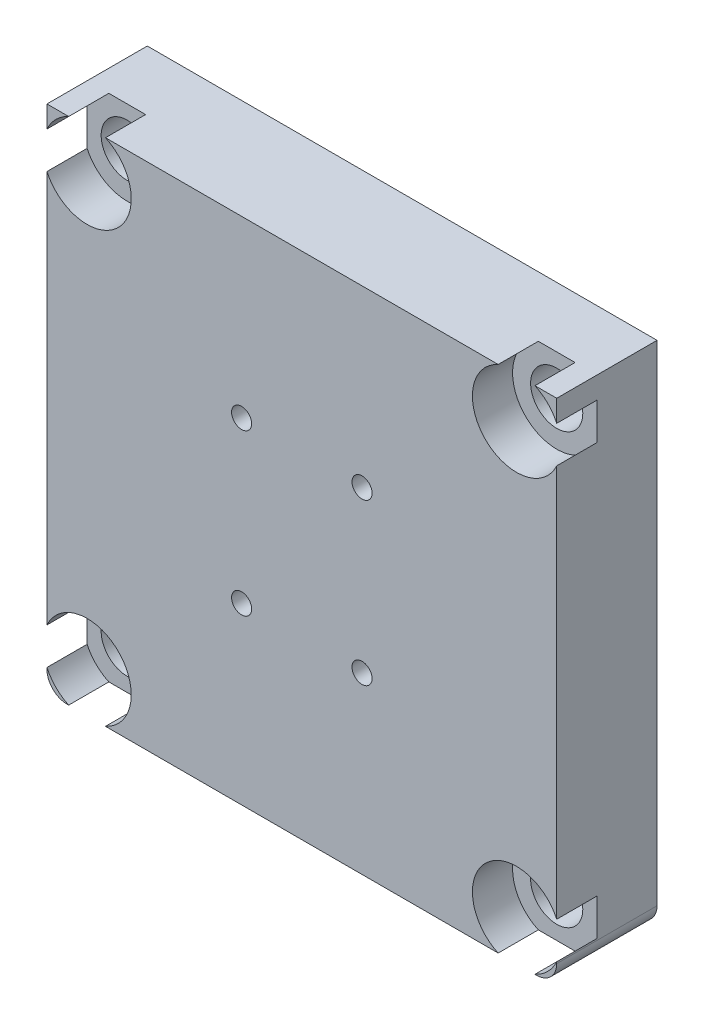
ISO-10303-21;
HEADER;
FILE_DESCRIPTION(('STEP AP214'),'2;1');
FILE_NAME('part.step','',(''),(''),'','','');
FILE_SCHEMA(('AUTOMOTIVE_DESIGN { 1 0 10303 214 1 1 1 1 }'));
ENDSEC;
DATA;
#1=APPLICATION_CONTEXT('core data for automotive mechanical design processes');
#2=APPLICATION_PROTOCOL_DEFINITION('international standard','automotive_design',2000,#1);
#3=PRODUCT_CONTEXT('',#1,'mechanical');
#4=PRODUCT('Part','Part','',(#3));
#5=PRODUCT_RELATED_PRODUCT_CATEGORY('part','',(#4));
#6=PRODUCT_DEFINITION_FORMATION('','',#4);
#7=PRODUCT_DEFINITION_CONTEXT('part definition',#1,'design');
#8=PRODUCT_DEFINITION('design','',#6,#7);
#9=PRODUCT_DEFINITION_SHAPE('','',#8);
#10=(LENGTH_UNIT() NAMED_UNIT(*) SI_UNIT(.MILLI.,.METRE.));
#11=(NAMED_UNIT(*) PLANE_ANGLE_UNIT() SI_UNIT($,.RADIAN.));
#12=(NAMED_UNIT(*) SI_UNIT($,.STERADIAN.) SOLID_ANGLE_UNIT());
#13=UNCERTAINTY_MEASURE_WITH_UNIT(LENGTH_MEASURE(1.E-05),#10,'distance_accuracy_value','');
#14=(GEOMETRIC_REPRESENTATION_CONTEXT(3) GLOBAL_UNCERTAINTY_ASSIGNED_CONTEXT((#13)) GLOBAL_UNIT_ASSIGNED_CONTEXT((#10,
#11,#12)) REPRESENTATION_CONTEXT('',''));
#15=CARTESIAN_POINT('',(0.,0.,0.));
#16=DIRECTION('',(0.,0.,1.));
#17=DIRECTION('',(1.,0.,0.));
#18=AXIS2_PLACEMENT_3D('',#15,#16,#17);
#19=CARTESIAN_POINT('',(-11.7,-11.7,5.));
#20=DIRECTION('',(0.,0.,1.));
#21=DIRECTION('',(1.,0.,0.));
#22=AXIS2_PLACEMENT_3D('',#19,#20,#21);
#23=PLANE('',#22);
#24=CARTESIAN_POINT('',(10.7,-10.7,5.));
#25=DIRECTION('',(0.,0.,1.));
#26=DIRECTION('',(1.,0.,0.));
#27=AXIS2_PLACEMENT_3D('',#24,#25,#26);
#28=CIRCLE('',#27,2.2);
#29=CARTESIAN_POINT('',(12.7,-9.78348486100883,5.));
#30=VERTEX_POINT('',#29);
#31=CARTESIAN_POINT('',(9.78348486100883,-12.7,5.));
#32=VERTEX_POINT('',#31);
#33=EDGE_CURVE('E187',#30,#32,#28,.T.);
#34=ORIENTED_EDGE('',*,*,#33,.F.);
#35=DIRECTION('',(0.,1.,0.));
#36=VECTOR('',#35,1.);
#37=CARTESIAN_POINT('',(12.7,-11.7,5.));
#38=LINE('',#37,#36);
#39=CARTESIAN_POINT('',(12.7,9.78348486100883,5.));
#40=VERTEX_POINT('',#39);
#41=EDGE_CURVE('E200',#30,#40,#38,.T.);
#42=ORIENTED_EDGE('',*,*,#41,.T.);
#43=CARTESIAN_POINT('',(10.7,10.7,5.));
#44=DIRECTION('',(0.,0.,1.));
#45=DIRECTION('',(1.,0.,0.));
#46=AXIS2_PLACEMENT_3D('',#43,#44,#45);
#47=CIRCLE('',#46,2.2);
#48=CARTESIAN_POINT('',(9.78348486100883,12.7,5.));
#49=VERTEX_POINT('',#48);
#50=EDGE_CURVE('E251',#49,#40,#47,.T.);
#51=ORIENTED_EDGE('',*,*,#50,.F.);
#52=DIRECTION('',(-1.,0.,0.));
#53=VECTOR('',#52,1.);
#54=CARTESIAN_POINT('',(12.7,12.7,5.));
#55=LINE('',#54,#53);
#56=CARTESIAN_POINT('',(-9.78348486100884,12.7,5.));
#57=VERTEX_POINT('',#56);
#58=EDGE_CURVE('E383',#49,#57,#55,.T.);
#59=ORIENTED_EDGE('',*,*,#58,.T.);
#60=CARTESIAN_POINT('',(-10.7,10.7,5.));
#61=DIRECTION('',(0.,0.,1.));
#62=DIRECTION('',(1.,0.,0.));
#63=AXIS2_PLACEMENT_3D('',#60,#61,#62);
#64=CIRCLE('',#63,2.2);
#65=CARTESIAN_POINT('',(-12.7,9.78348486100882,5.));
#66=VERTEX_POINT('',#65);
#67=EDGE_CURVE('E258',#66,#57,#64,.T.);
#68=ORIENTED_EDGE('',*,*,#67,.F.);
#69=DIRECTION('',(0.,-1.,0.));
#70=VECTOR('',#69,1.);
#71=CARTESIAN_POINT('',(-12.7,12.7,5.));
#72=LINE('',#71,#70);
#73=CARTESIAN_POINT('',(-12.7,-9.78348486100882,5.));
#74=VERTEX_POINT('',#73);
#75=EDGE_CURVE('E388',#66,#74,#72,.T.);
#76=ORIENTED_EDGE('',*,*,#75,.T.);
#77=CARTESIAN_POINT('',(-10.7,-10.7,5.));
#78=DIRECTION('',(0.,0.,1.));
#79=DIRECTION('',(1.,0.,0.));
#80=AXIS2_PLACEMENT_3D('',#77,#78,#79);
#81=CIRCLE('',#80,2.2);
#82=CARTESIAN_POINT('',(-9.78348486100882,-12.7,5.));
#83=VERTEX_POINT('',#82);
#84=EDGE_CURVE('E272',#83,#74,#81,.T.);
#85=ORIENTED_EDGE('',*,*,#84,.F.);
#86=DIRECTION('',(1.,0.,0.));
#87=VECTOR('',#86,1.);
#88=CARTESIAN_POINT('',(-11.7,-12.7,5.));
#89=LINE('',#88,#87);
#90=EDGE_CURVE('E203',#83,#32,#89,.T.);
#91=ORIENTED_EDGE('',*,*,#90,.T.);
#92=EDGE_LOOP('',(#34,#42,#51,#59,#68,#76,#85,#91));
#93=FACE_BOUND('',#92,.T.);
#94=CARTESIAN_POINT('',(3.,-4.,5.));
#95=DIRECTION('',(0.,0.,1.));
#96=DIRECTION('',(1.,0.,0.));
#97=AXIS2_PLACEMENT_3D('',#94,#95,#96);
#98=CIRCLE('',#97,0.499999999999999);
#99=CARTESIAN_POINT('',(3.5,-4.,5.));
#100=VERTEX_POINT('',#99);
#101=EDGE_CURVE('E356',#100,#100,#98,.T.);
#102=ORIENTED_EDGE('',*,*,#101,.F.);
#103=EDGE_LOOP('',(#102));
#104=FACE_BOUND('',#103,.T.);
#105=CARTESIAN_POINT('',(-3.,-4.,5.));
#106=DIRECTION('',(0.,0.,1.));
#107=DIRECTION('',(1.,0.,0.));
#108=AXIS2_PLACEMENT_3D('',#105,#106,#107);
#109=CIRCLE('',#108,0.499999999999999);
#110=CARTESIAN_POINT('',(-2.5,-4.,5.));
#111=VERTEX_POINT('',#110);
#112=EDGE_CURVE('E362',#111,#111,#109,.T.);
#113=ORIENTED_EDGE('',*,*,#112,.F.);
#114=EDGE_LOOP('',(#113));
#115=FACE_BOUND('',#114,.T.);
#116=CARTESIAN_POINT('',(-3.,4.,5.));
#117=DIRECTION('',(0.,0.,1.));
#118=DIRECTION('',(1.,0.,0.));
#119=AXIS2_PLACEMENT_3D('',#116,#117,#118);
#120=CIRCLE('',#119,0.499999999999999);
#121=CARTESIAN_POINT('',(-2.5,4.,5.));
#122=VERTEX_POINT('',#121);
#123=EDGE_CURVE('E368',#122,#122,#120,.T.);
#124=ORIENTED_EDGE('',*,*,#123,.F.);
#125=EDGE_LOOP('',(#124));
#126=FACE_BOUND('',#125,.T.);
#127=CARTESIAN_POINT('',(3.,4.,5.));
#128=DIRECTION('',(0.,0.,1.));
#129=DIRECTION('',(1.,0.,0.));
#130=AXIS2_PLACEMENT_3D('',#127,#128,#129);
#131=CIRCLE('',#130,0.499999999999999);
#132=CARTESIAN_POINT('',(3.5,4.,5.));
#133=VERTEX_POINT('',#132);
#134=EDGE_CURVE('E374',#133,#133,#131,.T.);
#135=ORIENTED_EDGE('',*,*,#134,.F.);
#136=EDGE_LOOP('',(#135));
#137=FACE_BOUND('',#136,.T.);
#138=ADVANCED_FACE('F33',(#93,#104,#115,#126,#137),#23,.T.);
#139=CARTESIAN_POINT('',(-12.7,-11.6165151389912,5.));
#140=VERTEX_POINT('',#139);
#141=CARTESIAN_POINT('',(-11.6165151389912,-12.7,5.));
#142=VERTEX_POINT('',#141);
#143=EDGE_CURVE('E277',#140,#142,#81,.T.);
#144=ORIENTED_EDGE('',*,*,#143,.F.);
#145=CARTESIAN_POINT('',(-12.7,-11.7,5.));
#146=VERTEX_POINT('',#145);
#147=EDGE_CURVE('E382',#140,#146,#72,.T.);
#148=ORIENTED_EDGE('',*,*,#147,.T.);
#149=CARTESIAN_POINT('',(-11.7,-11.7,5.));
#150=DIRECTION('',(0.,0.,1.));
#151=DIRECTION('',(1.,0.,0.));
#152=AXIS2_PLACEMENT_3D('',#149,#150,#151);
#153=CIRCLE('',#152,1.);
#154=CARTESIAN_POINT('',(-11.7,-12.7,5.));
#155=VERTEX_POINT('',#154);
#156=EDGE_CURVE('E387',#146,#155,#153,.T.);
#157=ORIENTED_EDGE('',*,*,#156,.T.);
#158=EDGE_CURVE('E390',#155,#142,#89,.T.);
#159=ORIENTED_EDGE('',*,*,#158,.T.);
#160=EDGE_LOOP('',(#144,#148,#157,#159));
#161=FACE_BOUND('',#160,.T.);
#162=ADVANCED_FACE('F452',(#161),#23,.T.);
#163=CARTESIAN_POINT('',(-11.6165151389912,12.7,5.));
#164=VERTEX_POINT('',#163);
#165=CARTESIAN_POINT('',(-12.7,11.6165151389912,5.));
#166=VERTEX_POINT('',#165);
#167=EDGE_CURVE('E263',#164,#166,#64,.T.);
#168=ORIENTED_EDGE('',*,*,#167,.F.);
#169=CARTESIAN_POINT('',(-12.7,12.7,5.));
#170=VERTEX_POINT('',#169);
#171=EDGE_CURVE('E233',#164,#170,#55,.T.);
#172=ORIENTED_EDGE('',*,*,#171,.T.);
#173=EDGE_CURVE('E384',#170,#166,#72,.T.);
#174=ORIENTED_EDGE('',*,*,#173,.T.);
#175=EDGE_LOOP('',(#168,#172,#174));
#176=FACE_BOUND('',#175,.T.);
#177=ADVANCED_FACE('F436',(#176),#23,.T.);
#178=CARTESIAN_POINT('',(12.7,11.6165151389912,5.));
#179=VERTEX_POINT('',#178);
#180=CARTESIAN_POINT('',(11.6165151389912,12.7,5.));
#181=VERTEX_POINT('',#180);
#182=EDGE_CURVE('E335',#179,#181,#47,.T.);
#183=ORIENTED_EDGE('',*,*,#182,.F.);
#184=CARTESIAN_POINT('',(12.7,12.7,5.));
#185=VERTEX_POINT('',#184);
#186=EDGE_CURVE('E211',#179,#185,#38,.T.);
#187=ORIENTED_EDGE('',*,*,#186,.T.);
#188=EDGE_CURVE('E379',#185,#181,#55,.T.);
#189=ORIENTED_EDGE('',*,*,#188,.T.);
#190=EDGE_LOOP('',(#183,#187,#189));
#191=FACE_BOUND('',#190,.T.);
#192=ADVANCED_FACE('F420',(#191),#23,.T.);
#193=CARTESIAN_POINT('',(12.7,12.7,5.));
#194=DIRECTION('',(0.,-1.,0.));
#195=DIRECTION('',(1.,0.,0.));
#196=AXIS2_PLACEMENT_3D('',#193,#194,#195);
#197=PLANE('',#196);
#198=DIRECTION('',(1.,0.,0.));
#199=VECTOR('',#198,1.);
#200=CARTESIAN_POINT('',(12.7,12.7,3.));
#201=LINE('',#200,#199);
#202=CARTESIAN_POINT('',(-11.6165151389912,12.7,3.));
#203=VERTEX_POINT('',#202);
#204=CARTESIAN_POINT('',(-9.78348486100884,12.7,3.));
#205=VERTEX_POINT('',#204);
#206=EDGE_CURVE('E269',#203,#205,#201,.T.);
#207=ORIENTED_EDGE('',*,*,#206,.T.);
#208=DIRECTION('',(0.,0.,1.));
#209=VECTOR('',#208,1.);
#210=CARTESIAN_POINT('',(-9.78348486100884,12.7,5.));
#211=LINE('',#210,#209);
#212=EDGE_CURVE('E332',#205,#57,#211,.T.);
#213=ORIENTED_EDGE('',*,*,#212,.T.);
#214=ORIENTED_EDGE('',*,*,#58,.F.);
#215=DIRECTION('',(0.,0.,1.));
#216=VECTOR('',#215,1.);
#217=CARTESIAN_POINT('',(9.78348486100883,12.7,5.));
#218=LINE('',#217,#216);
#219=CARTESIAN_POINT('',(9.78348486100883,12.7,3.));
#220=VERTEX_POINT('',#219);
#221=EDGE_CURVE('E347',#49,#220,#218,.F.);
#222=ORIENTED_EDGE('',*,*,#221,.T.);
#223=DIRECTION('',(1.,0.,0.));
#224=VECTOR('',#223,1.);
#225=CARTESIAN_POINT('',(12.7,12.7,3.));
#226=LINE('',#225,#224);
#227=CARTESIAN_POINT('',(11.6165151389912,12.7,3.));
#228=VERTEX_POINT('',#227);
#229=EDGE_CURVE('E353',#220,#228,#226,.T.);
#230=ORIENTED_EDGE('',*,*,#229,.T.);
#231=DIRECTION('',(0.,0.,1.));
#232=VECTOR('',#231,1.);
#233=CARTESIAN_POINT('',(11.6165151389912,12.7,5.));
#234=LINE('',#233,#232);
#235=EDGE_CURVE('E350',#228,#181,#234,.T.);
#236=ORIENTED_EDGE('',*,*,#235,.T.);
#237=ORIENTED_EDGE('',*,*,#188,.F.);
#238=DIRECTION('',(0.,0.,-1.));
#239=VECTOR('',#238,1.);
#240=CARTESIAN_POINT('',(12.7,12.7,5.));
#241=LINE('',#240,#239);
#242=CARTESIAN_POINT('',(12.7,12.7,0.));
#243=VERTEX_POINT('',#242);
#244=EDGE_CURVE('E214',#185,#243,#241,.T.);
#245=ORIENTED_EDGE('',*,*,#244,.T.);
#246=DIRECTION('',(-1.,0.,0.));
#247=VECTOR('',#246,1.);
#248=CARTESIAN_POINT('',(12.7,12.7,0.));
#249=LINE('',#248,#247);
#250=CARTESIAN_POINT('',(-12.7,12.7,0.));
#251=VERTEX_POINT('',#250);
#252=EDGE_CURVE('E219',#243,#251,#249,.T.);
#253=ORIENTED_EDGE('',*,*,#252,.T.);
#254=DIRECTION('',(0.,0.,-1.));
#255=VECTOR('',#254,1.);
#256=CARTESIAN_POINT('',(-12.7,12.7,5.));
#257=LINE('',#256,#255);
#258=EDGE_CURVE('E248',#170,#251,#257,.T.);
#259=ORIENTED_EDGE('',*,*,#258,.F.);
#260=ORIENTED_EDGE('',*,*,#171,.F.);
#261=DIRECTION('',(0.,0.,1.));
#262=VECTOR('',#261,1.);
#263=CARTESIAN_POINT('',(-11.6165151389912,12.7,5.));
#264=LINE('',#263,#262);
#265=EDGE_CURVE('E329',#164,#203,#264,.F.);
#266=ORIENTED_EDGE('',*,*,#265,.T.);
#267=EDGE_LOOP('',(#207,#213,#214,#222,#230,#236,#237,#245,#253,#259,#260,#266));
#268=FACE_BOUND('',#267,.T.);
#269=ADVANCED_FACE('F35',(#268),#197,.F.);
#270=CARTESIAN_POINT('',(-12.7,12.7,5.));
#271=DIRECTION('',(1.,0.,0.));
#272=DIRECTION('',(0.,0.,-1.));
#273=AXIS2_PLACEMENT_3D('',#270,#271,#272);
#274=PLANE('',#273);
#275=DIRECTION('',(0.,1.,0.));
#276=VECTOR('',#275,1.);
#277=CARTESIAN_POINT('',(-12.7,12.7,3.));
#278=LINE('',#277,#276);
#279=CARTESIAN_POINT('',(-12.7,-11.6165151389912,3.));
#280=VERTEX_POINT('',#279);
#281=CARTESIAN_POINT('',(-12.7,-9.78348486100882,3.));
#282=VERTEX_POINT('',#281);
#283=EDGE_CURVE('E276',#280,#282,#278,.T.);
#284=ORIENTED_EDGE('',*,*,#283,.T.);
#285=DIRECTION('',(0.,0.,1.));
#286=VECTOR('',#285,1.);
#287=CARTESIAN_POINT('',(-12.7,-9.78348486100882,5.));
#288=LINE('',#287,#286);
#289=EDGE_CURVE('E280',#282,#74,#288,.T.);
#290=ORIENTED_EDGE('',*,*,#289,.T.);
#291=ORIENTED_EDGE('',*,*,#75,.F.);
#292=DIRECTION('',(0.,0.,1.));
#293=VECTOR('',#292,1.);
#294=CARTESIAN_POINT('',(-12.7,9.78348486100882,5.));
#295=LINE('',#294,#293);
#296=CARTESIAN_POINT('',(-12.7,9.78348486100882,3.));
#297=VERTEX_POINT('',#296);
#298=EDGE_CURVE('E259',#66,#297,#295,.F.);
#299=ORIENTED_EDGE('',*,*,#298,.T.);
#300=DIRECTION('',(0.,1.,0.));
#301=VECTOR('',#300,1.);
#302=CARTESIAN_POINT('',(-12.7,12.7,3.));
#303=LINE('',#302,#301);
#304=CARTESIAN_POINT('',(-12.7,11.6165151389912,3.));
#305=VERTEX_POINT('',#304);
#306=EDGE_CURVE('E262',#297,#305,#303,.T.);
#307=ORIENTED_EDGE('',*,*,#306,.T.);
#308=DIRECTION('',(0.,0.,1.));
#309=VECTOR('',#308,1.);
#310=CARTESIAN_POINT('',(-12.7,11.6165151389912,5.));
#311=LINE('',#310,#309);
#312=EDGE_CURVE('E266',#305,#166,#311,.T.);
#313=ORIENTED_EDGE('',*,*,#312,.T.);
#314=ORIENTED_EDGE('',*,*,#173,.F.);
#315=ORIENTED_EDGE('',*,*,#258,.T.);
#316=DIRECTION('',(0.,-1.,0.));
#317=VECTOR('',#316,1.);
#318=CARTESIAN_POINT('',(-12.7,12.7,0.));
#319=LINE('',#318,#317);
#320=CARTESIAN_POINT('',(-12.7,-11.7,0.));
#321=VERTEX_POINT('',#320);
#322=EDGE_CURVE('E222',#251,#321,#319,.T.);
#323=ORIENTED_EDGE('',*,*,#322,.T.);
#324=DIRECTION('',(0.,0.,-1.));
#325=VECTOR('',#324,1.);
#326=CARTESIAN_POINT('',(-12.7,-11.7,5.));
#327=LINE('',#326,#325);
#328=EDGE_CURVE('E245',#146,#321,#327,.T.);
#329=ORIENTED_EDGE('',*,*,#328,.F.);
#330=ORIENTED_EDGE('',*,*,#147,.F.);
#331=DIRECTION('',(0.,0.,1.));
#332=VECTOR('',#331,1.);
#333=CARTESIAN_POINT('',(-12.7,-11.6165151389912,5.));
#334=LINE('',#333,#332);
#335=EDGE_CURVE('E273',#140,#280,#334,.F.);
#336=ORIENTED_EDGE('',*,*,#335,.T.);
#337=EDGE_LOOP('',(#284,#290,#291,#299,#307,#313,#314,#315,#323,#329,#330,#336));
#338=FACE_BOUND('',#337,.T.);
#339=ADVANCED_FACE('F438',(#338),#274,.F.);
#340=CARTESIAN_POINT('',(-11.7,-11.7,5.));
#341=DIRECTION('',(0.,0.,-1.));
#342=DIRECTION('',(-1.,0.,0.));
#343=AXIS2_PLACEMENT_3D('',#340,#341,#342);
#344=CYLINDRICAL_SURFACE('',#343,1.);
#345=CARTESIAN_POINT('',(-11.7,-11.7,0.));
#346=DIRECTION('',(0.,0.,1.));
#347=DIRECTION('',(1.,0.,0.));
#348=AXIS2_PLACEMENT_3D('',#345,#346,#347);
#349=CIRCLE('',#348,1.);
#350=CARTESIAN_POINT('',(-11.7,-12.7,0.));
#351=VERTEX_POINT('',#350);
#352=EDGE_CURVE('E225',#321,#351,#349,.T.);
#353=ORIENTED_EDGE('',*,*,#352,.T.);
#354=DIRECTION('',(0.,0.,-1.));
#355=VECTOR('',#354,1.);
#356=CARTESIAN_POINT('',(-11.7,-12.7,5.));
#357=LINE('',#356,#355);
#358=EDGE_CURVE('E242',#155,#351,#357,.T.);
#359=ORIENTED_EDGE('',*,*,#358,.F.);
#360=ORIENTED_EDGE('',*,*,#156,.F.);
#361=ORIENTED_EDGE('',*,*,#328,.T.);
#362=EDGE_LOOP('',(#353,#359,#360,#361));
#363=FACE_BOUND('',#362,.T.);
#364=ADVANCED_FACE('F456',(#363),#344,.T.);
#365=CARTESIAN_POINT('',(-11.7,-12.7,5.));
#366=DIRECTION('',(0.,1.,0.));
#367=DIRECTION('',(-1.,0.,0.));
#368=AXIS2_PLACEMENT_3D('',#365,#366,#367);
#369=PLANE('',#368);
#370=DIRECTION('',(-1.,0.,0.));
#371=VECTOR('',#370,1.);
#372=CARTESIAN_POINT('',(-11.7,-12.7,3.));
#373=LINE('',#372,#371);
#374=CARTESIAN_POINT('',(11.6165151389912,-12.7,3.));
#375=VERTEX_POINT('',#374);
#376=CARTESIAN_POINT('',(9.78348486100883,-12.7,3.));
#377=VERTEX_POINT('',#376);
#378=EDGE_CURVE('E290',#375,#377,#373,.T.);
#379=ORIENTED_EDGE('',*,*,#378,.T.);
#380=DIRECTION('',(0.,0.,1.));
#381=VECTOR('',#380,1.);
#382=CARTESIAN_POINT('',(9.78348486100883,-12.7,5.));
#383=LINE('',#382,#381);
#384=EDGE_CURVE('E300',#377,#32,#383,.T.);
#385=ORIENTED_EDGE('',*,*,#384,.T.);
#386=ORIENTED_EDGE('',*,*,#90,.F.);
#387=DIRECTION('',(0.,0.,1.));
#388=VECTOR('',#387,1.);
#389=CARTESIAN_POINT('',(-9.78348486100882,-12.7,5.));
#390=LINE('',#389,#388);
#391=CARTESIAN_POINT('',(-9.78348486100882,-12.7,3.));
#392=VERTEX_POINT('',#391);
#393=EDGE_CURVE('E56',#83,#392,#390,.F.);
#394=ORIENTED_EDGE('',*,*,#393,.T.);
#395=DIRECTION('',(-1.,0.,0.));
#396=VECTOR('',#395,1.);
#397=CARTESIAN_POINT('',(-11.7,-12.7,3.));
#398=LINE('',#397,#396);
#399=CARTESIAN_POINT('',(-11.6165151389912,-12.7,3.));
#400=VERTEX_POINT('',#399);
#401=EDGE_CURVE('E283',#392,#400,#398,.T.);
#402=ORIENTED_EDGE('',*,*,#401,.T.);
#403=DIRECTION('',(0.,0.,1.));
#404=VECTOR('',#403,1.);
#405=CARTESIAN_POINT('',(-11.6165151389912,-12.7,5.));
#406=LINE('',#405,#404);
#407=EDGE_CURVE('E315',#400,#142,#406,.T.);
#408=ORIENTED_EDGE('',*,*,#407,.T.);
#409=ORIENTED_EDGE('',*,*,#158,.F.);
#410=ORIENTED_EDGE('',*,*,#358,.T.);
#411=DIRECTION('',(1.,0.,0.));
#412=VECTOR('',#411,1.);
#413=CARTESIAN_POINT('',(-11.7,-12.7,0.));
#414=LINE('',#413,#412);
#415=CARTESIAN_POINT('',(11.7,-12.7,0.));
#416=VERTEX_POINT('',#415);
#417=EDGE_CURVE('E227',#351,#416,#414,.T.);
#418=ORIENTED_EDGE('',*,*,#417,.T.);
#419=DIRECTION('',(0.,0.,-1.));
#420=VECTOR('',#419,1.);
#421=CARTESIAN_POINT('',(11.7,-12.7,5.));
#422=LINE('',#421,#420);
#423=CARTESIAN_POINT('',(11.7,-12.7,5.));
#424=VERTEX_POINT('',#423);
#425=EDGE_CURVE('E239',#424,#416,#422,.T.);
#426=ORIENTED_EDGE('',*,*,#425,.F.);
#427=CARTESIAN_POINT('',(11.6165151389912,-12.7,5.));
#428=VERTEX_POINT('',#427);
#429=EDGE_CURVE('E389',#428,#424,#89,.T.);
#430=ORIENTED_EDGE('',*,*,#429,.F.);
#431=DIRECTION('',(0.,0.,1.));
#432=VECTOR('',#431,1.);
#433=CARTESIAN_POINT('',(11.6165151389912,-12.7,5.));
#434=LINE('',#433,#432);
#435=EDGE_CURVE('E48',#428,#375,#434,.F.);
#436=ORIENTED_EDGE('',*,*,#435,.T.);
#437=EDGE_LOOP('',(#379,#385,#386,#394,#402,#408,#409,#410,#418,#426,#430,#436));
#438=FACE_BOUND('',#437,.T.);
#439=ADVANCED_FACE('F402',(#438),#369,.F.);
#440=CARTESIAN_POINT('',(11.7,-11.7,5.));
#441=DIRECTION('',(0.,0.,-1.));
#442=DIRECTION('',(-1.,0.,0.));
#443=AXIS2_PLACEMENT_3D('',#440,#441,#442);
#444=CYLINDRICAL_SURFACE('',#443,1.);
#445=CARTESIAN_POINT('',(11.7,-11.7,0.));
#446=DIRECTION('',(0.,0.,1.));
#447=DIRECTION('',(1.,0.,0.));
#448=AXIS2_PLACEMENT_3D('',#445,#446,#447);
#449=CIRCLE('',#448,1.);
#450=CARTESIAN_POINT('',(12.7,-11.7,0.));
#451=VERTEX_POINT('',#450);
#452=EDGE_CURVE('E229',#416,#451,#449,.T.);
#453=ORIENTED_EDGE('',*,*,#452,.T.);
#454=DIRECTION('',(0.,0.,-1.));
#455=VECTOR('',#454,1.);
#456=CARTESIAN_POINT('',(12.7,-11.7,5.));
#457=LINE('',#456,#455);
#458=CARTESIAN_POINT('',(12.7,-11.7,5.));
#459=VERTEX_POINT('',#458);
#460=EDGE_CURVE('E236',#459,#451,#457,.T.);
#461=ORIENTED_EDGE('',*,*,#460,.F.);
#462=CARTESIAN_POINT('',(11.7,-11.7,5.));
#463=DIRECTION('',(0.,0.,1.));
#464=DIRECTION('',(1.,0.,0.));
#465=AXIS2_PLACEMENT_3D('',#462,#463,#464);
#466=CIRCLE('',#465,1.);
#467=EDGE_CURVE('E215',#424,#459,#466,.T.);
#468=ORIENTED_EDGE('',*,*,#467,.F.);
#469=ORIENTED_EDGE('',*,*,#425,.T.);
#470=EDGE_LOOP('',(#453,#461,#468,#469));
#471=FACE_BOUND('',#470,.T.);
#472=ADVANCED_FACE('F406',(#471),#444,.T.);
#473=CARTESIAN_POINT('',(12.7,-11.7,5.));
#474=DIRECTION('',(-1.,0.,0.));
#475=DIRECTION('',(0.,0.,1.));
#476=AXIS2_PLACEMENT_3D('',#473,#474,#475);
#477=PLANE('',#476);
#478=DIRECTION('',(0.,-1.,0.));
#479=VECTOR('',#478,1.);
#480=CARTESIAN_POINT('',(12.7,-11.7,3.));
#481=LINE('',#480,#479);
#482=CARTESIAN_POINT('',(12.7,-9.78348486100883,3.));
#483=VERTEX_POINT('',#482);
#484=CARTESIAN_POINT('',(12.7,-11.6165151389912,3.));
#485=VERTEX_POINT('',#484);
#486=EDGE_CURVE('E41',#483,#485,#481,.T.);
#487=ORIENTED_EDGE('',*,*,#486,.T.);
#488=DIRECTION('',(0.,0.,1.));
#489=VECTOR('',#488,1.);
#490=CARTESIAN_POINT('',(12.7,-11.6165151389912,5.));
#491=LINE('',#490,#489);
#492=CARTESIAN_POINT('',(12.7,-11.6165151389912,5.));
#493=VERTEX_POINT('',#492);
#494=EDGE_CURVE('E11',#485,#493,#491,.T.);
#495=ORIENTED_EDGE('',*,*,#494,.T.);
#496=EDGE_CURVE('E210',#459,#493,#38,.T.);
#497=ORIENTED_EDGE('',*,*,#496,.F.);
#498=ORIENTED_EDGE('',*,*,#460,.T.);
#499=DIRECTION('',(0.,1.,0.));
#500=VECTOR('',#499,1.);
#501=CARTESIAN_POINT('',(12.7,-11.7,0.));
#502=LINE('',#501,#500);
#503=EDGE_CURVE('E231',#451,#243,#502,.T.);
#504=ORIENTED_EDGE('',*,*,#503,.T.);
#505=ORIENTED_EDGE('',*,*,#244,.F.);
#506=ORIENTED_EDGE('',*,*,#186,.F.);
#507=DIRECTION('',(0.,0.,1.));
#508=VECTOR('',#507,1.);
#509=CARTESIAN_POINT('',(12.7,11.6165151389912,5.));
#510=LINE('',#509,#508);
#511=CARTESIAN_POINT('',(12.7,11.6165151389912,3.));
#512=VERTEX_POINT('',#511);
#513=EDGE_CURVE('E252',#179,#512,#510,.F.);
#514=ORIENTED_EDGE('',*,*,#513,.T.);
#515=DIRECTION('',(0.,-1.,0.));
#516=VECTOR('',#515,1.);
#517=CARTESIAN_POINT('',(12.7,-11.7,3.));
#518=LINE('',#517,#516);
#519=CARTESIAN_POINT('',(12.7,9.78348486100883,3.));
#520=VERTEX_POINT('',#519);
#521=EDGE_CURVE('E255',#512,#520,#518,.T.);
#522=ORIENTED_EDGE('',*,*,#521,.T.);
#523=DIRECTION('',(0.,0.,1.));
#524=VECTOR('',#523,1.);
#525=CARTESIAN_POINT('',(12.7,9.78348486100883,5.));
#526=LINE('',#525,#524);
#527=EDGE_CURVE('E209',#520,#40,#526,.T.);
#528=ORIENTED_EDGE('',*,*,#527,.T.);
#529=ORIENTED_EDGE('',*,*,#41,.F.);
#530=DIRECTION('',(0.,0.,1.));
#531=VECTOR('',#530,1.);
#532=CARTESIAN_POINT('',(12.7,-9.78348486100883,5.));
#533=LINE('',#532,#531);
#534=EDGE_CURVE('E184',#30,#483,#533,.F.);
#535=ORIENTED_EDGE('',*,*,#534,.T.);
#536=EDGE_LOOP('',(#487,#495,#497,#498,#504,#505,#506,#514,#522,#528,#529,#535));
#537=FACE_BOUND('',#536,.T.);
#538=ADVANCED_FACE('F207',(#537),#477,.F.);
#539=EDGE_CURVE('E194',#428,#493,#28,.T.);
#540=ORIENTED_EDGE('',*,*,#539,.F.);
#541=ORIENTED_EDGE('',*,*,#429,.T.);
#542=ORIENTED_EDGE('',*,*,#467,.T.);
#543=ORIENTED_EDGE('',*,*,#496,.T.);
#544=EDGE_LOOP('',(#540,#541,#542,#543));
#545=FACE_BOUND('',#544,.T.);
#546=ADVANCED_FACE('F398',(#545),#23,.T.);
#547=CARTESIAN_POINT('',(-11.7,-11.7,0.));
#548=DIRECTION('',(0.,0.,1.));
#549=DIRECTION('',(1.,0.,0.));
#550=AXIS2_PLACEMENT_3D('',#547,#548,#549);
#551=PLANE('',#550);
#552=CARTESIAN_POINT('',(10.7,-10.7,0.));
#553=DIRECTION('',(0.,0.,1.));
#554=DIRECTION('',(1.,0.,0.));
#555=AXIS2_PLACEMENT_3D('',#552,#553,#554);
#556=CIRCLE('',#555,1.3);
#557=CARTESIAN_POINT('',(12.,-10.7,0.));
#558=VERTEX_POINT('',#557);
#559=EDGE_CURVE('E296',#558,#558,#556,.T.);
#560=ORIENTED_EDGE('',*,*,#559,.T.);
#561=EDGE_LOOP('',(#560));
#562=FACE_BOUND('',#561,.T.);
#563=CARTESIAN_POINT('',(-10.7,-10.7,0.));
#564=DIRECTION('',(0.,0.,1.));
#565=DIRECTION('',(1.,0.,0.));
#566=AXIS2_PLACEMENT_3D('',#563,#564,#565);
#567=CIRCLE('',#566,1.3);
#568=CARTESIAN_POINT('',(-9.4,-10.7,0.));
#569=VERTEX_POINT('',#568);
#570=EDGE_CURVE('E311',#569,#569,#567,.T.);
#571=ORIENTED_EDGE('',*,*,#570,.T.);
#572=EDGE_LOOP('',(#571));
#573=FACE_BOUND('',#572,.T.);
#574=CARTESIAN_POINT('',(-10.7,10.7,0.));
#575=DIRECTION('',(0.,0.,1.));
#576=DIRECTION('',(1.,0.,0.));
#577=AXIS2_PLACEMENT_3D('',#574,#575,#576);
#578=CIRCLE('',#577,1.3);
#579=CARTESIAN_POINT('',(-9.4,10.7,0.));
#580=VERTEX_POINT('',#579);
#581=EDGE_CURVE('E326',#580,#580,#578,.T.);
#582=ORIENTED_EDGE('',*,*,#581,.T.);
#583=EDGE_LOOP('',(#582));
#584=FACE_BOUND('',#583,.T.);
#585=CARTESIAN_POINT('',(10.7,10.7,0.));
#586=DIRECTION('',(0.,0.,1.));
#587=DIRECTION('',(1.,0.,0.));
#588=AXIS2_PLACEMENT_3D('',#585,#586,#587);
#589=CIRCLE('',#588,1.3);
#590=CARTESIAN_POINT('',(12.,10.7,0.));
#591=VERTEX_POINT('',#590);
#592=EDGE_CURVE('E344',#591,#591,#589,.T.);
#593=ORIENTED_EDGE('',*,*,#592,.T.);
#594=EDGE_LOOP('',(#593));
#595=FACE_BOUND('',#594,.T.);
#596=CARTESIAN_POINT('',(3.,-4.,0.));
#597=DIRECTION('',(0.,0.,1.));
#598=DIRECTION('',(1.,0.,0.));
#599=AXIS2_PLACEMENT_3D('',#596,#597,#598);
#600=CIRCLE('',#599,0.499999999999998);
#601=CARTESIAN_POINT('',(3.5,-4.,0.));
#602=VERTEX_POINT('',#601);
#603=EDGE_CURVE('E359',#602,#602,#600,.T.);
#604=ORIENTED_EDGE('',*,*,#603,.T.);
#605=EDGE_LOOP('',(#604));
#606=FACE_BOUND('',#605,.T.);
#607=CARTESIAN_POINT('',(-3.,-4.,0.));
#608=DIRECTION('',(0.,0.,1.));
#609=DIRECTION('',(1.,0.,0.));
#610=AXIS2_PLACEMENT_3D('',#607,#608,#609);
#611=CIRCLE('',#610,0.499999999999998);
#612=CARTESIAN_POINT('',(-2.5,-4.,0.));
#613=VERTEX_POINT('',#612);
#614=EDGE_CURVE('E365',#613,#613,#611,.T.);
#615=ORIENTED_EDGE('',*,*,#614,.T.);
#616=EDGE_LOOP('',(#615));
#617=FACE_BOUND('',#616,.T.);
#618=CARTESIAN_POINT('',(-3.,4.,0.));
#619=DIRECTION('',(0.,0.,1.));
#620=DIRECTION('',(1.,0.,0.));
#621=AXIS2_PLACEMENT_3D('',#618,#619,#620);
#622=CIRCLE('',#621,0.499999999999998);
#623=CARTESIAN_POINT('',(-2.5,4.,0.));
#624=VERTEX_POINT('',#623);
#625=EDGE_CURVE('E371',#624,#624,#622,.T.);
#626=ORIENTED_EDGE('',*,*,#625,.T.);
#627=EDGE_LOOP('',(#626));
#628=FACE_BOUND('',#627,.T.);
#629=CARTESIAN_POINT('',(3.,4.,0.));
#630=DIRECTION('',(0.,0.,1.));
#631=DIRECTION('',(1.,0.,0.));
#632=AXIS2_PLACEMENT_3D('',#629,#630,#631);
#633=CIRCLE('',#632,0.499999999999998);
#634=CARTESIAN_POINT('',(3.5,4.,0.));
#635=VERTEX_POINT('',#634);
#636=EDGE_CURVE('E223',#635,#635,#633,.T.);
#637=ORIENTED_EDGE('',*,*,#636,.T.);
#638=EDGE_LOOP('',(#637));
#639=FACE_BOUND('',#638,.T.);
#640=ORIENTED_EDGE('',*,*,#252,.F.);
#641=ORIENTED_EDGE('',*,*,#503,.F.);
#642=ORIENTED_EDGE('',*,*,#452,.F.);
#643=ORIENTED_EDGE('',*,*,#417,.F.);
#644=ORIENTED_EDGE('',*,*,#352,.F.);
#645=ORIENTED_EDGE('',*,*,#322,.F.);
#646=EDGE_LOOP('',(#640,#641,#642,#643,#644,#645));
#647=FACE_BOUND('',#646,.T.);
#648=ADVANCED_FACE('F411',(#562,#573,#584,#595,#606,#617,#628,#639,#647),#551,.F.);
#649=CARTESIAN_POINT('',(3.,4.,5.));
#650=DIRECTION('',(0.,0.,1.));
#651=DIRECTION('',(1.,0.,0.));
#652=AXIS2_PLACEMENT_3D('',#649,#650,#651);
#653=CYLINDRICAL_SURFACE('',#652,0.499999999999999);
#654=ORIENTED_EDGE('',*,*,#636,.F.);
#655=EDGE_LOOP('',(#654));
#656=FACE_BOUND('',#655,.T.);
#657=ORIENTED_EDGE('',*,*,#134,.T.);
#658=EDGE_LOOP('',(#657));
#659=FACE_BOUND('',#658,.T.);
#660=ADVANCED_FACE('F487',(#656,#659),#653,.F.);
#661=CARTESIAN_POINT('',(-3.,4.,5.));
#662=DIRECTION('',(0.,0.,1.));
#663=DIRECTION('',(1.,0.,0.));
#664=AXIS2_PLACEMENT_3D('',#661,#662,#663);
#665=CYLINDRICAL_SURFACE('',#664,0.499999999999999);
#666=ORIENTED_EDGE('',*,*,#625,.F.);
#667=EDGE_LOOP('',(#666));
#668=FACE_BOUND('',#667,.T.);
#669=ORIENTED_EDGE('',*,*,#123,.T.);
#670=EDGE_LOOP('',(#669));
#671=FACE_BOUND('',#670,.T.);
#672=ADVANCED_FACE('F528',(#668,#671),#665,.F.);
#673=CARTESIAN_POINT('',(-3.,-4.,5.));
#674=DIRECTION('',(0.,0.,1.));
#675=DIRECTION('',(1.,0.,0.));
#676=AXIS2_PLACEMENT_3D('',#673,#674,#675);
#677=CYLINDRICAL_SURFACE('',#676,0.499999999999999);
#678=ORIENTED_EDGE('',*,*,#614,.F.);
#679=EDGE_LOOP('',(#678));
#680=FACE_BOUND('',#679,.T.);
#681=ORIENTED_EDGE('',*,*,#112,.T.);
#682=EDGE_LOOP('',(#681));
#683=FACE_BOUND('',#682,.T.);
#684=ADVANCED_FACE('F516',(#680,#683),#677,.F.);
#685=CARTESIAN_POINT('',(3.,-4.,5.));
#686=DIRECTION('',(0.,0.,1.));
#687=DIRECTION('',(1.,0.,0.));
#688=AXIS2_PLACEMENT_3D('',#685,#686,#687);
#689=CYLINDRICAL_SURFACE('',#688,0.499999999999999);
#690=ORIENTED_EDGE('',*,*,#603,.F.);
#691=EDGE_LOOP('',(#690));
#692=FACE_BOUND('',#691,.T.);
#693=ORIENTED_EDGE('',*,*,#101,.T.);
#694=EDGE_LOOP('',(#693));
#695=FACE_BOUND('',#694,.T.);
#696=ADVANCED_FACE('F511',(#692,#695),#689,.F.);
#697=CARTESIAN_POINT('',(12.,10.7,3.));
#698=DIRECTION('',(0.,0.,-1.));
#699=DIRECTION('',(-1.,0.,0.));
#700=AXIS2_PLACEMENT_3D('',#697,#698,#699);
#701=PLANE('',#700);
#702=CARTESIAN_POINT('',(10.7,10.7,3.));
#703=DIRECTION('',(0.,0.,1.));
#704=DIRECTION('',(1.,0.,0.));
#705=AXIS2_PLACEMENT_3D('',#702,#703,#704);
#706=CIRCLE('',#705,1.3);
#707=CARTESIAN_POINT('',(12.,10.7,3.));
#708=VERTEX_POINT('',#707);
#709=EDGE_CURVE('E341',#708,#708,#706,.T.);
#710=ORIENTED_EDGE('',*,*,#709,.F.);
#711=EDGE_LOOP('',(#710));
#712=FACE_BOUND('',#711,.T.);
#713=CARTESIAN_POINT('',(10.7,10.7,3.));
#714=DIRECTION('',(0.,0.,1.));
#715=DIRECTION('',(1.,0.,0.));
#716=AXIS2_PLACEMENT_3D('',#713,#714,#715);
#717=CIRCLE('',#716,2.2);
#718=EDGE_CURVE('E337',#220,#520,#717,.T.);
#719=ORIENTED_EDGE('',*,*,#718,.T.);
#720=ORIENTED_EDGE('',*,*,#521,.F.);
#721=EDGE_CURVE('E338',#512,#228,#717,.T.);
#722=ORIENTED_EDGE('',*,*,#721,.T.);
#723=ORIENTED_EDGE('',*,*,#229,.F.);
#724=EDGE_LOOP('',(#719,#720,#722,#723));
#725=FACE_BOUND('',#724,.T.);
#726=ADVANCED_FACE('F428',(#712,#725),#701,.F.);
#727=CARTESIAN_POINT('',(10.7,10.7,5.));
#728=DIRECTION('',(0.,0.,1.));
#729=DIRECTION('',(1.,0.,0.));
#730=AXIS2_PLACEMENT_3D('',#727,#728,#729);
#731=CYLINDRICAL_SURFACE('',#730,2.2);
#732=ORIENTED_EDGE('',*,*,#721,.F.);
#733=ORIENTED_EDGE('',*,*,#513,.F.);
#734=ORIENTED_EDGE('',*,*,#182,.T.);
#735=ORIENTED_EDGE('',*,*,#235,.F.);
#736=EDGE_LOOP('',(#732,#733,#734,#735));
#737=FACE_BOUND('',#736,.T.);
#738=ADVANCED_FACE('F423',(#737),#731,.F.);
#739=ORIENTED_EDGE('',*,*,#50,.T.);
#740=ORIENTED_EDGE('',*,*,#527,.F.);
#741=ORIENTED_EDGE('',*,*,#718,.F.);
#742=ORIENTED_EDGE('',*,*,#221,.F.);
#743=EDGE_LOOP('',(#739,#740,#741,#742));
#744=FACE_BOUND('',#743,.T.);
#745=ADVANCED_FACE('F430',(#744),#731,.F.);
#746=CARTESIAN_POINT('',(10.7,10.7,5.));
#747=DIRECTION('',(0.,0.,1.));
#748=DIRECTION('',(1.,0.,0.));
#749=AXIS2_PLACEMENT_3D('',#746,#747,#748);
#750=CYLINDRICAL_SURFACE('',#749,1.3);
#751=ORIENTED_EDGE('',*,*,#592,.F.);
#752=EDGE_LOOP('',(#751));
#753=FACE_BOUND('',#752,.T.);
#754=ORIENTED_EDGE('',*,*,#709,.T.);
#755=EDGE_LOOP('',(#754));
#756=FACE_BOUND('',#755,.T.);
#757=ADVANCED_FACE('F616',(#753,#756),#750,.F.);
#758=CARTESIAN_POINT('',(-9.4,10.7,3.));
#759=DIRECTION('',(0.,0.,-1.));
#760=DIRECTION('',(-1.,0.,0.));
#761=AXIS2_PLACEMENT_3D('',#758,#759,#760);
#762=PLANE('',#761);
#763=CARTESIAN_POINT('',(-10.7,10.7,3.));
#764=DIRECTION('',(0.,0.,1.));
#765=DIRECTION('',(1.,0.,0.));
#766=AXIS2_PLACEMENT_3D('',#763,#764,#765);
#767=CIRCLE('',#766,1.3);
#768=CARTESIAN_POINT('',(-9.4,10.7,3.));
#769=VERTEX_POINT('',#768);
#770=EDGE_CURVE('E323',#769,#769,#767,.T.);
#771=ORIENTED_EDGE('',*,*,#770,.F.);
#772=EDGE_LOOP('',(#771));
#773=FACE_BOUND('',#772,.T.);
#774=CARTESIAN_POINT('',(-10.7,10.7,3.));
#775=DIRECTION('',(0.,0.,1.));
#776=DIRECTION('',(1.,0.,0.));
#777=AXIS2_PLACEMENT_3D('',#774,#775,#776);
#778=CIRCLE('',#777,2.2);
#779=EDGE_CURVE('E318',#297,#205,#778,.T.);
#780=ORIENTED_EDGE('',*,*,#779,.T.);
#781=ORIENTED_EDGE('',*,*,#206,.F.);
#782=EDGE_CURVE('E322',#203,#305,#778,.T.);
#783=ORIENTED_EDGE('',*,*,#782,.T.);
#784=ORIENTED_EDGE('',*,*,#306,.F.);
#785=EDGE_LOOP('',(#780,#781,#783,#784));
#786=FACE_BOUND('',#785,.T.);
#787=ADVANCED_FACE('F444',(#773,#786),#762,.F.);
#788=CARTESIAN_POINT('',(-10.7,10.7,5.));
#789=DIRECTION('',(0.,0.,1.));
#790=DIRECTION('',(1.,0.,0.));
#791=AXIS2_PLACEMENT_3D('',#788,#789,#790);
#792=CYLINDRICAL_SURFACE('',#791,2.2);
#793=ORIENTED_EDGE('',*,*,#779,.F.);
#794=ORIENTED_EDGE('',*,*,#298,.F.);
#795=ORIENTED_EDGE('',*,*,#67,.T.);
#796=ORIENTED_EDGE('',*,*,#212,.F.);
#797=EDGE_LOOP('',(#793,#794,#795,#796));
#798=FACE_BOUND('',#797,.T.);
#799=ADVANCED_FACE('F447',(#798),#792,.F.);
#800=ORIENTED_EDGE('',*,*,#782,.F.);
#801=ORIENTED_EDGE('',*,*,#265,.F.);
#802=ORIENTED_EDGE('',*,*,#167,.T.);
#803=ORIENTED_EDGE('',*,*,#312,.F.);
#804=EDGE_LOOP('',(#800,#801,#802,#803));
#805=FACE_BOUND('',#804,.T.);
#806=ADVANCED_FACE('F442',(#805),#792,.F.);
#807=CARTESIAN_POINT('',(-10.7,10.7,5.));
#808=DIRECTION('',(0.,0.,1.));
#809=DIRECTION('',(1.,0.,0.));
#810=AXIS2_PLACEMENT_3D('',#807,#808,#809);
#811=CYLINDRICAL_SURFACE('',#810,1.3);
#812=ORIENTED_EDGE('',*,*,#581,.F.);
#813=EDGE_LOOP('',(#812));
#814=FACE_BOUND('',#813,.T.);
#815=ORIENTED_EDGE('',*,*,#770,.T.);
#816=EDGE_LOOP('',(#815));
#817=FACE_BOUND('',#816,.T.);
#818=ADVANCED_FACE('F650',(#814,#817),#811,.F.);
#819=CARTESIAN_POINT('',(-9.4,-10.7,3.));
#820=DIRECTION('',(0.,0.,-1.));
#821=DIRECTION('',(-1.,0.,0.));
#822=AXIS2_PLACEMENT_3D('',#819,#820,#821);
#823=PLANE('',#822);
#824=CARTESIAN_POINT('',(-10.7,-10.7,3.));
#825=DIRECTION('',(0.,0.,1.));
#826=DIRECTION('',(1.,0.,0.));
#827=AXIS2_PLACEMENT_3D('',#824,#825,#826);
#828=CIRCLE('',#827,1.3);
#829=CARTESIAN_POINT('',(-9.4,-10.7,3.));
#830=VERTEX_POINT('',#829);
#831=EDGE_CURVE('E308',#830,#830,#828,.T.);
#832=ORIENTED_EDGE('',*,*,#831,.F.);
#833=EDGE_LOOP('',(#832));
#834=FACE_BOUND('',#833,.T.);
#835=CARTESIAN_POINT('',(-10.7,-10.7,3.));
#836=DIRECTION('',(0.,0.,1.));
#837=DIRECTION('',(1.,0.,0.));
#838=AXIS2_PLACEMENT_3D('',#835,#836,#837);
#839=CIRCLE('',#838,2.2);
#840=EDGE_CURVE('E307',#280,#400,#839,.T.);
#841=ORIENTED_EDGE('',*,*,#840,.T.);
#842=ORIENTED_EDGE('',*,*,#401,.F.);
#843=EDGE_CURVE('E303',#392,#282,#839,.T.);
#844=ORIENTED_EDGE('',*,*,#843,.T.);
#845=ORIENTED_EDGE('',*,*,#283,.F.);
#846=EDGE_LOOP('',(#841,#842,#844,#845));
#847=FACE_BOUND('',#846,.T.);
#848=ADVANCED_FACE('F462',(#834,#847),#823,.F.);
#849=CARTESIAN_POINT('',(-10.7,-10.7,5.));
#850=DIRECTION('',(0.,0.,1.));
#851=DIRECTION('',(1.,0.,0.));
#852=AXIS2_PLACEMENT_3D('',#849,#850,#851);
#853=CYLINDRICAL_SURFACE('',#852,2.2);
#854=ORIENTED_EDGE('',*,*,#840,.F.);
#855=ORIENTED_EDGE('',*,*,#335,.F.);
#856=ORIENTED_EDGE('',*,*,#143,.T.);
#857=ORIENTED_EDGE('',*,*,#407,.F.);
#858=EDGE_LOOP('',(#854,#855,#856,#857));
#859=FACE_BOUND('',#858,.T.);
#860=ADVANCED_FACE('F460',(#859),#853,.F.);
#861=ORIENTED_EDGE('',*,*,#84,.T.);
#862=ORIENTED_EDGE('',*,*,#289,.F.);
#863=ORIENTED_EDGE('',*,*,#843,.F.);
#864=ORIENTED_EDGE('',*,*,#393,.F.);
#865=EDGE_LOOP('',(#861,#862,#863,#864));
#866=FACE_BOUND('',#865,.T.);
#867=ADVANCED_FACE('F463',(#866),#853,.F.);
#868=CARTESIAN_POINT('',(-10.7,-10.7,5.));
#869=DIRECTION('',(0.,0.,1.));
#870=DIRECTION('',(1.,0.,0.));
#871=AXIS2_PLACEMENT_3D('',#868,#869,#870);
#872=CYLINDRICAL_SURFACE('',#871,1.3);
#873=ORIENTED_EDGE('',*,*,#570,.F.);
#874=EDGE_LOOP('',(#873));
#875=FACE_BOUND('',#874,.T.);
#876=ORIENTED_EDGE('',*,*,#831,.T.);
#877=EDGE_LOOP('',(#876));
#878=FACE_BOUND('',#877,.T.);
#879=ADVANCED_FACE('F465',(#875,#878),#872,.F.);
#880=CARTESIAN_POINT('',(12.,-10.7,3.));
#881=DIRECTION('',(0.,0.,-1.));
#882=DIRECTION('',(-1.,0.,0.));
#883=AXIS2_PLACEMENT_3D('',#880,#881,#882);
#884=PLANE('',#883);
#885=CARTESIAN_POINT('',(10.7,-10.7,3.));
#886=DIRECTION('',(0.,0.,1.));
#887=DIRECTION('',(1.,0.,0.));
#888=AXIS2_PLACEMENT_3D('',#885,#886,#887);
#889=CIRCLE('',#888,1.3);
#890=CARTESIAN_POINT('',(12.,-10.7,3.));
#891=VERTEX_POINT('',#890);
#892=EDGE_CURVE('E292',#891,#891,#889,.T.);
#893=ORIENTED_EDGE('',*,*,#892,.F.);
#894=EDGE_LOOP('',(#893));
#895=FACE_BOUND('',#894,.T.);
#896=CARTESIAN_POINT('',(10.7,-10.7,3.));
#897=DIRECTION('',(0.,0.,1.));
#898=DIRECTION('',(1.,0.,0.));
#899=AXIS2_PLACEMENT_3D('',#896,#897,#898);
#900=CIRCLE('',#899,2.2);
#901=EDGE_CURVE('E204',#375,#485,#900,.T.);
#902=ORIENTED_EDGE('',*,*,#901,.T.);
#903=ORIENTED_EDGE('',*,*,#486,.F.);
#904=EDGE_CURVE('E190',#483,#377,#900,.T.);
#905=ORIENTED_EDGE('',*,*,#904,.T.);
#906=ORIENTED_EDGE('',*,*,#378,.F.);
#907=EDGE_LOOP('',(#902,#903,#905,#906));
#908=FACE_BOUND('',#907,.T.);
#909=ADVANCED_FACE('F288',(#895,#908),#884,.F.);
#910=CARTESIAN_POINT('',(10.7,-10.7,5.));
#911=DIRECTION('',(0.,0.,1.));
#912=DIRECTION('',(1.,0.,0.));
#913=AXIS2_PLACEMENT_3D('',#910,#911,#912);
#914=CYLINDRICAL_SURFACE('',#913,2.2);
#915=ORIENTED_EDGE('',*,*,#904,.F.);
#916=ORIENTED_EDGE('',*,*,#534,.F.);
#917=ORIENTED_EDGE('',*,*,#33,.T.);
#918=ORIENTED_EDGE('',*,*,#384,.F.);
#919=EDGE_LOOP('',(#915,#916,#917,#918));
#920=FACE_BOUND('',#919,.T.);
#921=ADVANCED_FACE('F186',(#920),#914,.F.);
#922=ORIENTED_EDGE('',*,*,#539,.T.);
#923=ORIENTED_EDGE('',*,*,#494,.F.);
#924=ORIENTED_EDGE('',*,*,#901,.F.);
#925=ORIENTED_EDGE('',*,*,#435,.F.);
#926=EDGE_LOOP('',(#922,#923,#924,#925));
#927=FACE_BOUND('',#926,.T.);
#928=ADVANCED_FACE('F700',(#927),#914,.F.);
#929=CARTESIAN_POINT('',(10.7,-10.7,5.));
#930=DIRECTION('',(0.,0.,1.));
#931=DIRECTION('',(1.,0.,0.));
#932=AXIS2_PLACEMENT_3D('',#929,#930,#931);
#933=CYLINDRICAL_SURFACE('',#932,1.3);
#934=ORIENTED_EDGE('',*,*,#559,.F.);
#935=EDGE_LOOP('',(#934));
#936=FACE_BOUND('',#935,.T.);
#937=ORIENTED_EDGE('',*,*,#892,.T.);
#938=EDGE_LOOP('',(#937));
#939=FACE_BOUND('',#938,.T.);
#940=ADVANCED_FACE('F709',(#936,#939),#933,.F.);
#941=CLOSED_SHELL('',(#138,#162,#177,#192,#269,#339,#364,#439,#472,#538,#546,#648,#660,#672,
#684,#696,#726,#738,#745,#757,#787,#799,#806,#818,#848,#860,#867,#879,#909,#921,#928,#940));
#942=MANIFOLD_SOLID_BREP('B2',#941);
#943=ADVANCED_BREP_SHAPE_REPRESENTATION('',(#18,#942),#14);
#944=SHAPE_DEFINITION_REPRESENTATION(#9,#943);
ENDSEC;
END-ISO-10303-21;
